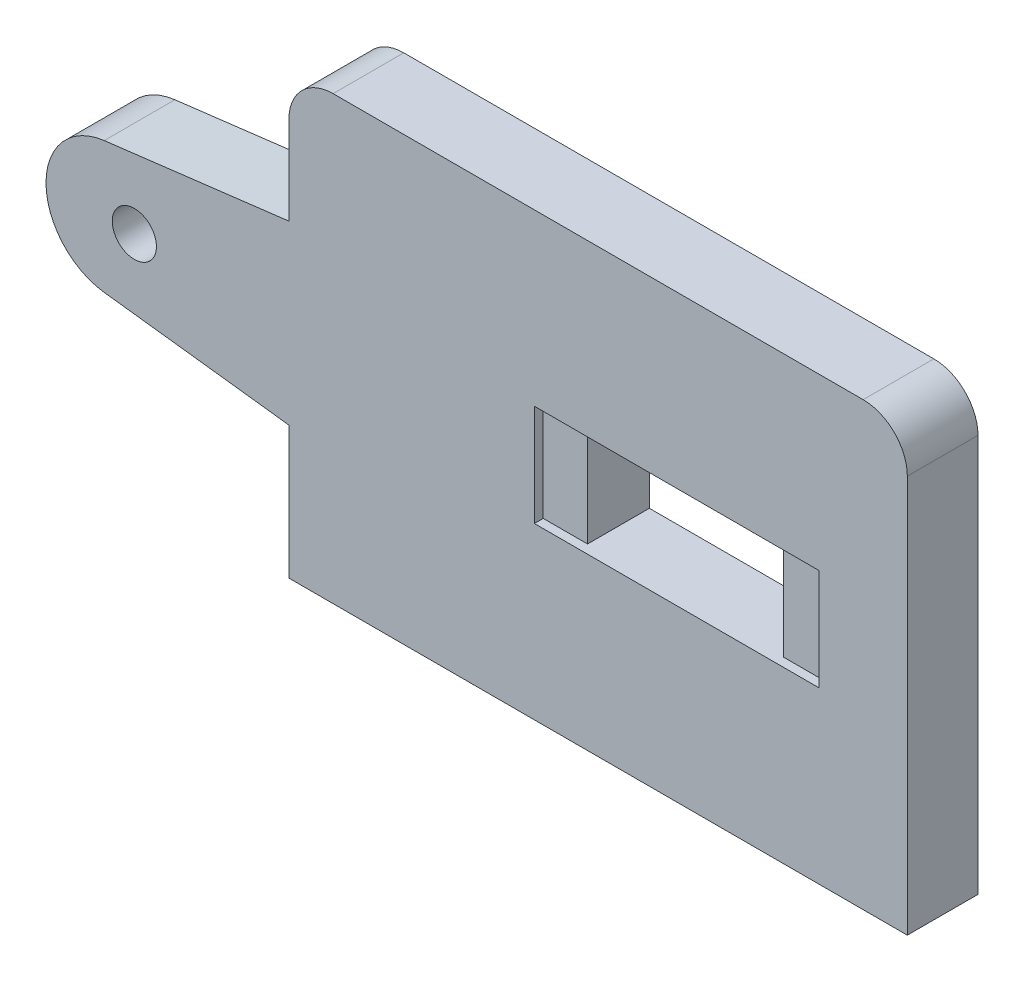
ISO-10303-21;
HEADER;
FILE_DESCRIPTION(('STEP AP214'),'2;1');
FILE_NAME('part.step','',(''),(''),'','','');
FILE_SCHEMA(('AUTOMOTIVE_DESIGN { 1 0 10303 214 1 1 1 1 }'));
ENDSEC;
DATA;
#1=APPLICATION_CONTEXT('core data for automotive mechanical design processes');
#2=APPLICATION_PROTOCOL_DEFINITION('international standard','automotive_design',2000,#1);
#3=PRODUCT_CONTEXT('',#1,'mechanical');
#4=PRODUCT('Part','Part','',(#3));
#5=PRODUCT_RELATED_PRODUCT_CATEGORY('part','',(#4));
#6=PRODUCT_DEFINITION_FORMATION('','',#4);
#7=PRODUCT_DEFINITION_CONTEXT('part definition',#1,'design');
#8=PRODUCT_DEFINITION('design','',#6,#7);
#9=PRODUCT_DEFINITION_SHAPE('','',#8);
#10=(LENGTH_UNIT() NAMED_UNIT(*) SI_UNIT(.MILLI.,.METRE.));
#11=(NAMED_UNIT(*) PLANE_ANGLE_UNIT() SI_UNIT($,.RADIAN.));
#12=(NAMED_UNIT(*) SI_UNIT($,.STERADIAN.) SOLID_ANGLE_UNIT());
#13=UNCERTAINTY_MEASURE_WITH_UNIT(LENGTH_MEASURE(1.E-05),#10,'distance_accuracy_value','');
#14=(GEOMETRIC_REPRESENTATION_CONTEXT(3) GLOBAL_UNCERTAINTY_ASSIGNED_CONTEXT((#13)) GLOBAL_UNIT_ASSIGNED_CONTEXT((#10,
#11,#12)) REPRESENTATION_CONTEXT('',''));
#15=CARTESIAN_POINT('',(0.,0.,0.));
#16=DIRECTION('',(0.,0.,1.));
#17=DIRECTION('',(1.,0.,0.));
#18=AXIS2_PLACEMENT_3D('',#15,#16,#17);
#19=CARTESIAN_POINT('',(0.,0.,8.));
#20=DIRECTION('',(0.,0.,1.));
#21=DIRECTION('',(1.,0.,0.));
#22=AXIS2_PLACEMENT_3D('',#19,#20,#21);
#23=PLANE('',#22);
#24=DIRECTION('',(1.,0.,0.));
#25=VECTOR('',#24,1.);
#26=CARTESIAN_POINT('',(-2.2,-5.75,8.));
#27=LINE('',#26,#25);
#28=CARTESIAN_POINT('',(-7.21473826229797,-5.75,8.));
#29=VERTEX_POINT('',#28);
#30=CARTESIAN_POINT('',(25.014738262298,-5.75,8.));
#31=VERTEX_POINT('',#30);
#32=EDGE_CURVE('E234',#29,#31,#27,.T.);
#33=ORIENTED_EDGE('',*,*,#32,.F.);
#34=DIRECTION('',(0.,-1.,0.));
#35=VECTOR('',#34,1.);
#36=CARTESIAN_POINT('',(-7.21473826229797,0.,8.));
#37=LINE('',#36,#35);
#38=CARTESIAN_POINT('',(-7.21473826229797,5.74999999999999,8.));
#39=VERTEX_POINT('',#38);
#40=EDGE_CURVE('E192',#39,#29,#37,.T.);
#41=ORIENTED_EDGE('',*,*,#40,.F.);
#42=DIRECTION('',(-1.,0.,0.));
#43=VECTOR('',#42,1.);
#44=CARTESIAN_POINT('',(-2.2,5.75,8.));
#45=LINE('',#44,#43);
#46=CARTESIAN_POINT('',(25.014738262298,5.75,8.));
#47=VERTEX_POINT('',#46);
#48=EDGE_CURVE('E173',#47,#39,#45,.T.);
#49=ORIENTED_EDGE('',*,*,#48,.F.);
#50=DIRECTION('',(0.,-1.,0.));
#51=VECTOR('',#50,1.);
#52=CARTESIAN_POINT('',(25.014738262298,0.,8.));
#53=LINE('',#52,#51);
#54=EDGE_CURVE('E207',#47,#31,#53,.T.);
#55=ORIENTED_EDGE('',*,*,#54,.T.);
#56=EDGE_LOOP('',(#33,#41,#49,#55));
#57=FACE_BOUND('',#56,.T.);
#58=CARTESIAN_POINT('',(-52.5,0.,8.));
#59=DIRECTION('',(0.,0.,1.));
#60=DIRECTION('',(1.,0.,0.));
#61=AXIS2_PLACEMENT_3D('',#58,#59,#60);
#62=CIRCLE('',#61,2.5);
#63=CARTESIAN_POINT('',(-50.,0.,8.));
#64=VERTEX_POINT('',#63);
#65=EDGE_CURVE('E201',#64,#64,#62,.T.);
#66=ORIENTED_EDGE('',*,*,#65,.F.);
#67=EDGE_LOOP('',(#66));
#68=FACE_BOUND('',#67,.T.);
#69=DIRECTION('',(-0.992614977317636,-0.121307488658818,0.));
#70=VECTOR('',#69,1.);
#71=CARTESIAN_POINT('',(-1.71915903920014,14.0672519855765,8.));
#72=LINE('',#71,#70);
#73=CARTESIAN_POINT('',(-35.,10.,8.));
#74=VERTEX_POINT('',#73);
#75=CARTESIAN_POINT('',(-55.9098061649411,7.44461232988227,8.));
#76=VERTEX_POINT('',#75);
#77=EDGE_CURVE('E264',#74,#76,#72,.T.);
#78=ORIENTED_EDGE('',*,*,#77,.T.);
#79=CARTESIAN_POINT('',(-55.,0.,8.));
#80=DIRECTION('',(0.,0.,1.));
#81=DIRECTION('',(1.,0.,0.));
#82=AXIS2_PLACEMENT_3D('',#79,#80,#81);
#83=CIRCLE('',#82,7.5);
#84=CARTESIAN_POINT('',(-55.9098061649411,-7.44461232988227,8.));
#85=VERTEX_POINT('',#84);
#86=EDGE_CURVE('E268',#76,#85,#83,.T.);
#87=ORIENTED_EDGE('',*,*,#86,.T.);
#88=DIRECTION('',(-0.992614977317636,0.121307488658818,0.));
#89=VECTOR('',#88,1.);
#90=CARTESIAN_POINT('',(-1.71915903920014,-14.0672519855765,8.));
#91=LINE('',#90,#89);
#92=CARTESIAN_POINT('',(-35.,-10.,8.));
#93=VERTEX_POINT('',#92);
#94=EDGE_CURVE('E272',#93,#85,#91,.T.);
#95=ORIENTED_EDGE('',*,*,#94,.F.);
#96=DIRECTION('',(0.,-1.,0.));
#97=VECTOR('',#96,1.);
#98=CARTESIAN_POINT('',(-35.,0.,8.));
#99=LINE('',#98,#97);
#100=CARTESIAN_POINT('',(-35.,-25.,8.));
#101=VERTEX_POINT('',#100);
#102=EDGE_CURVE('E276',#93,#101,#99,.T.);
#103=ORIENTED_EDGE('',*,*,#102,.T.);
#104=DIRECTION('',(1.,0.,0.));
#105=VECTOR('',#104,1.);
#106=CARTESIAN_POINT('',(0.,-25.,8.));
#107=LINE('',#106,#105);
#108=CARTESIAN_POINT('',(35.,-25.,8.));
#109=VERTEX_POINT('',#108);
#110=EDGE_CURVE('E279',#101,#109,#107,.T.);
#111=ORIENTED_EDGE('',*,*,#110,.T.);
#112=DIRECTION('',(0.,-1.,0.));
#113=VECTOR('',#112,1.);
#114=CARTESIAN_POINT('',(35.,0.,8.));
#115=LINE('',#114,#113);
#116=CARTESIAN_POINT('',(35.,20.,8.));
#117=VERTEX_POINT('',#116);
#118=EDGE_CURVE('E282',#117,#109,#115,.T.);
#119=ORIENTED_EDGE('',*,*,#118,.F.);
#120=CARTESIAN_POINT('',(30.,20.,8.));
#121=DIRECTION('',(0.,0.,1.));
#122=DIRECTION('',(1.,0.,0.));
#123=AXIS2_PLACEMENT_3D('',#120,#121,#122);
#124=CIRCLE('',#123,5.);
#125=CARTESIAN_POINT('',(30.,25.,8.));
#126=VERTEX_POINT('',#125);
#127=EDGE_CURVE('E286',#126,#117,#124,.F.);
#128=ORIENTED_EDGE('',*,*,#127,.F.);
#129=DIRECTION('',(1.,0.,0.));
#130=VECTOR('',#129,1.);
#131=CARTESIAN_POINT('',(0.,25.,8.));
#132=LINE('',#131,#130);
#133=CARTESIAN_POINT('',(-30.,25.,8.));
#134=VERTEX_POINT('',#133);
#135=EDGE_CURVE('E290',#134,#126,#132,.T.);
#136=ORIENTED_EDGE('',*,*,#135,.F.);
#137=CARTESIAN_POINT('',(-30.,20.,8.));
#138=DIRECTION('',(0.,0.,1.));
#139=DIRECTION('',(1.,0.,0.));
#140=AXIS2_PLACEMENT_3D('',#137,#138,#139);
#141=CIRCLE('',#140,5.);
#142=CARTESIAN_POINT('',(-35.,20.,8.));
#143=VERTEX_POINT('',#142);
#144=EDGE_CURVE('E294',#134,#143,#141,.T.);
#145=ORIENTED_EDGE('',*,*,#144,.T.);
#146=DIRECTION('',(0.,-1.,0.));
#147=VECTOR('',#146,1.);
#148=CARTESIAN_POINT('',(-35.,0.,8.));
#149=LINE('',#148,#147);
#150=EDGE_CURVE('E297',#143,#74,#149,.T.);
#151=ORIENTED_EDGE('',*,*,#150,.T.);
#152=EDGE_LOOP('',(#78,#87,#95,#103,#111,#119,#128,#136,#145,#151));
#153=FACE_BOUND('',#152,.T.);
#154=ADVANCED_FACE('F40',(#57,#68,#153),#23,.T.);
#155=CARTESIAN_POINT('',(20.,5.75,0.));
#156=DIRECTION('',(1.,0.,0.));
#157=DIRECTION('',(0.,0.,-1.));
#158=AXIS2_PLACEMENT_3D('',#155,#156,#157);
#159=PLANE('',#158);
#160=DIRECTION('',(0.,-1.,0.));
#161=VECTOR('',#160,1.);
#162=CARTESIAN_POINT('',(20.,0.,7.));
#163=LINE('',#162,#161);
#164=CARTESIAN_POINT('',(20.,5.75,7.));
#165=VERTEX_POINT('',#164);
#166=CARTESIAN_POINT('',(20.,-5.75,7.));
#167=VERTEX_POINT('',#166);
#168=EDGE_CURVE('E213',#165,#167,#163,.T.);
#169=ORIENTED_EDGE('',*,*,#168,.F.);
#170=DIRECTION('',(0.,0.,1.));
#171=VECTOR('',#170,1.);
#172=CARTESIAN_POINT('',(20.,5.75,0.));
#173=LINE('',#172,#171);
#174=CARTESIAN_POINT('',(20.,5.75,0.));
#175=VERTEX_POINT('',#174);
#176=EDGE_CURVE('E244',#175,#165,#173,.T.);
#177=ORIENTED_EDGE('',*,*,#176,.F.);
#178=DIRECTION('',(0.,1.,0.));
#179=VECTOR('',#178,1.);
#180=CARTESIAN_POINT('',(20.,5.75,0.));
#181=LINE('',#180,#179);
#182=CARTESIAN_POINT('',(20.,-5.75,0.));
#183=VERTEX_POINT('',#182);
#184=EDGE_CURVE('E229',#183,#175,#181,.T.);
#185=ORIENTED_EDGE('',*,*,#184,.F.);
#186=DIRECTION('',(0.,0.,1.));
#187=VECTOR('',#186,1.);
#188=CARTESIAN_POINT('',(20.,-5.75,0.));
#189=LINE('',#188,#187);
#190=EDGE_CURVE('E249',#183,#167,#189,.T.);
#191=ORIENTED_EDGE('',*,*,#190,.T.);
#192=EDGE_LOOP('',(#169,#177,#185,#191));
#193=FACE_BOUND('',#192,.T.);
#194=ADVANCED_FACE('F418',(#193),#159,.F.);
#195=CARTESIAN_POINT('',(-2.2,5.75,0.));
#196=DIRECTION('',(-1.,0.,0.));
#197=DIRECTION('',(0.,-1.,0.));
#198=AXIS2_PLACEMENT_3D('',#195,#196,#197);
#199=PLANE('',#198);
#200=DIRECTION('',(0.,1.,0.));
#201=VECTOR('',#200,1.);
#202=CARTESIAN_POINT('',(-2.2,0.,7.));
#203=LINE('',#202,#201);
#204=CARTESIAN_POINT('',(-2.2,-5.75,7.));
#205=VERTEX_POINT('',#204);
#206=CARTESIAN_POINT('',(-2.2,5.75,7.));
#207=VERTEX_POINT('',#206);
#208=EDGE_CURVE('E57',#205,#207,#203,.T.);
#209=ORIENTED_EDGE('',*,*,#208,.F.);
#210=DIRECTION('',(0.,0.,1.));
#211=VECTOR('',#210,1.);
#212=CARTESIAN_POINT('',(-2.2,-5.75,0.));
#213=LINE('',#212,#211);
#214=CARTESIAN_POINT('',(-2.2,-5.75,0.));
#215=VERTEX_POINT('',#214);
#216=EDGE_CURVE('E254',#215,#205,#213,.T.);
#217=ORIENTED_EDGE('',*,*,#216,.F.);
#218=DIRECTION('',(0.,-1.,0.));
#219=VECTOR('',#218,1.);
#220=CARTESIAN_POINT('',(-2.2,5.75,0.));
#221=LINE('',#220,#219);
#222=CARTESIAN_POINT('',(-2.2,5.75,0.));
#223=VERTEX_POINT('',#222);
#224=EDGE_CURVE('E65',#223,#215,#221,.T.);
#225=ORIENTED_EDGE('',*,*,#224,.F.);
#226=DIRECTION('',(0.,0.,1.));
#227=VECTOR('',#226,1.);
#228=CARTESIAN_POINT('',(-2.2,5.75,0.));
#229=LINE('',#228,#227);
#230=EDGE_CURVE('E258',#223,#207,#229,.T.);
#231=ORIENTED_EDGE('',*,*,#230,.T.);
#232=EDGE_LOOP('',(#209,#217,#225,#231));
#233=FACE_BOUND('',#232,.T.);
#234=ADVANCED_FACE('F425',(#233),#199,.F.);
#235=CARTESIAN_POINT('',(-1.71915903920014,14.0672519855765,8.));
#236=DIRECTION('',(0.121307488658818,-0.992614977317636,0.));
#237=DIRECTION('',(0.992614977317636,0.121307488658818,0.));
#238=AXIS2_PLACEMENT_3D('',#235,#236,#237);
#239=PLANE('',#238);
#240=DIRECTION('',(-0.992614977317636,-0.121307488658818,0.));
#241=VECTOR('',#240,1.);
#242=CARTESIAN_POINT('',(-1.71915903920014,14.0672519855765,0.));
#243=LINE('',#242,#241);
#244=CARTESIAN_POINT('',(-35.,10.,0.));
#245=VERTEX_POINT('',#244);
#246=CARTESIAN_POINT('',(-55.9098061649411,7.44461232988227,0.));
#247=VERTEX_POINT('',#246);
#248=EDGE_CURVE('E253',#245,#247,#243,.T.);
#249=ORIENTED_EDGE('',*,*,#248,.T.);
#250=DIRECTION('',(0.,0.,-1.));
#251=VECTOR('',#250,1.);
#252=CARTESIAN_POINT('',(-55.9098061649411,7.44461232988227,8.));
#253=LINE('',#252,#251);
#254=EDGE_CURVE('E11',#76,#247,#253,.T.);
#255=ORIENTED_EDGE('',*,*,#254,.F.);
#256=ORIENTED_EDGE('',*,*,#77,.F.);
#257=DIRECTION('',(0.,0.,-1.));
#258=VECTOR('',#257,1.);
#259=CARTESIAN_POINT('',(-35.,10.,8.));
#260=LINE('',#259,#258);
#261=EDGE_CURVE('E300',#74,#245,#260,.T.);
#262=ORIENTED_EDGE('',*,*,#261,.T.);
#263=EDGE_LOOP('',(#249,#255,#256,#262));
#264=FACE_BOUND('',#263,.T.);
#265=ADVANCED_FACE('F42',(#264),#239,.F.);
#266=CARTESIAN_POINT('',(-55.,0.,8.));
#267=DIRECTION('',(0.,0.,-1.));
#268=DIRECTION('',(-1.,0.,0.));
#269=AXIS2_PLACEMENT_3D('',#266,#267,#268);
#270=CYLINDRICAL_SURFACE('',#269,7.5);
#271=CARTESIAN_POINT('',(-55.,0.,0.));
#272=DIRECTION('',(0.,0.,1.));
#273=DIRECTION('',(1.,0.,0.));
#274=AXIS2_PLACEMENT_3D('',#271,#272,#273);
#275=CIRCLE('',#274,7.5);
#276=CARTESIAN_POINT('',(-55.9098061649411,-7.44461232988227,0.));
#277=VERTEX_POINT('',#276);
#278=EDGE_CURVE('E304',#247,#277,#275,.T.);
#279=ORIENTED_EDGE('',*,*,#278,.T.);
#280=DIRECTION('',(0.,0.,-1.));
#281=VECTOR('',#280,1.);
#282=CARTESIAN_POINT('',(-55.9098061649411,-7.44461232988227,8.));
#283=LINE('',#282,#281);
#284=EDGE_CURVE('E50',#85,#277,#283,.T.);
#285=ORIENTED_EDGE('',*,*,#284,.F.);
#286=ORIENTED_EDGE('',*,*,#86,.F.);
#287=ORIENTED_EDGE('',*,*,#254,.T.);
#288=EDGE_LOOP('',(#279,#285,#286,#287));
#289=FACE_BOUND('',#288,.T.);
#290=ADVANCED_FACE('F369',(#289),#270,.T.);
#291=CARTESIAN_POINT('',(-1.71915903920014,-14.0672519855765,8.));
#292=DIRECTION('',(-0.121307488658818,-0.992614977317636,0.));
#293=DIRECTION('',(0.992614977317636,-0.121307488658818,0.));
#294=AXIS2_PLACEMENT_3D('',#291,#292,#293);
#295=PLANE('',#294);
#296=DIRECTION('',(-0.992614977317636,0.121307488658818,0.));
#297=VECTOR('',#296,1.);
#298=CARTESIAN_POINT('',(-1.71915903920014,-14.0672519855765,0.));
#299=LINE('',#298,#297);
#300=CARTESIAN_POINT('',(-35.,-10.,0.));
#301=VERTEX_POINT('',#300);
#302=EDGE_CURVE('E308',#301,#277,#299,.T.);
#303=ORIENTED_EDGE('',*,*,#302,.F.);
#304=DIRECTION('',(0.,0.,-1.));
#305=VECTOR('',#304,1.);
#306=CARTESIAN_POINT('',(-35.,-10.,8.));
#307=LINE('',#306,#305);
#308=EDGE_CURVE('E359',#93,#301,#307,.T.);
#309=ORIENTED_EDGE('',*,*,#308,.F.);
#310=ORIENTED_EDGE('',*,*,#94,.T.);
#311=ORIENTED_EDGE('',*,*,#284,.T.);
#312=EDGE_LOOP('',(#303,#309,#310,#311));
#313=FACE_BOUND('',#312,.T.);
#314=ADVANCED_FACE('F366',(#313),#295,.T.);
#315=CARTESIAN_POINT('',(-35.,0.,8.));
#316=DIRECTION('',(1.,0.,0.));
#317=DIRECTION('',(0.,1.,0.));
#318=AXIS2_PLACEMENT_3D('',#315,#316,#317);
#319=PLANE('',#318);
#320=DIRECTION('',(0.,-1.,0.));
#321=VECTOR('',#320,1.);
#322=CARTESIAN_POINT('',(-35.,0.,0.));
#323=LINE('',#322,#321);
#324=CARTESIAN_POINT('',(-35.,-25.,0.));
#325=VERTEX_POINT('',#324);
#326=EDGE_CURVE('E312',#301,#325,#323,.T.);
#327=ORIENTED_EDGE('',*,*,#326,.T.);
#328=DIRECTION('',(0.,0.,-1.));
#329=VECTOR('',#328,1.);
#330=CARTESIAN_POINT('',(-35.,-25.,8.));
#331=LINE('',#330,#329);
#332=EDGE_CURVE('E355',#101,#325,#331,.T.);
#333=ORIENTED_EDGE('',*,*,#332,.F.);
#334=ORIENTED_EDGE('',*,*,#102,.F.);
#335=ORIENTED_EDGE('',*,*,#308,.T.);
#336=EDGE_LOOP('',(#327,#333,#334,#335));
#337=FACE_BOUND('',#336,.T.);
#338=ADVANCED_FACE('F378',(#337),#319,.F.);
#339=CARTESIAN_POINT('',(0.,-25.,8.));
#340=DIRECTION('',(0.,1.,0.));
#341=DIRECTION('',(0.,0.,1.));
#342=AXIS2_PLACEMENT_3D('',#339,#340,#341);
#343=PLANE('',#342);
#344=DIRECTION('',(1.,0.,0.));
#345=VECTOR('',#344,1.);
#346=CARTESIAN_POINT('',(0.,-25.,0.));
#347=LINE('',#346,#345);
#348=CARTESIAN_POINT('',(35.,-25.,0.));
#349=VERTEX_POINT('',#348);
#350=EDGE_CURVE('E315',#325,#349,#347,.T.);
#351=ORIENTED_EDGE('',*,*,#350,.T.);
#352=DIRECTION('',(0.,0.,-1.));
#353=VECTOR('',#352,1.);
#354=CARTESIAN_POINT('',(35.,-25.,8.));
#355=LINE('',#354,#353);
#356=EDGE_CURVE('E352',#109,#349,#355,.T.);
#357=ORIENTED_EDGE('',*,*,#356,.F.);
#358=ORIENTED_EDGE('',*,*,#110,.F.);
#359=ORIENTED_EDGE('',*,*,#332,.T.);
#360=EDGE_LOOP('',(#351,#357,#358,#359));
#361=FACE_BOUND('',#360,.T.);
#362=ADVANCED_FACE('F382',(#361),#343,.F.);
#363=CARTESIAN_POINT('',(35.,0.,8.));
#364=DIRECTION('',(1.,0.,0.));
#365=DIRECTION('',(0.,1.,0.));
#366=AXIS2_PLACEMENT_3D('',#363,#364,#365);
#367=PLANE('',#366);
#368=DIRECTION('',(0.,-1.,0.));
#369=VECTOR('',#368,1.);
#370=CARTESIAN_POINT('',(35.,0.,0.));
#371=LINE('',#370,#369);
#372=CARTESIAN_POINT('',(35.,20.,0.));
#373=VERTEX_POINT('',#372);
#374=EDGE_CURVE('E319',#373,#349,#371,.T.);
#375=ORIENTED_EDGE('',*,*,#374,.F.);
#376=DIRECTION('',(0.,0.,-1.));
#377=VECTOR('',#376,1.);
#378=CARTESIAN_POINT('',(35.,20.,8.));
#379=LINE('',#378,#377);
#380=EDGE_CURVE('E349',#117,#373,#379,.T.);
#381=ORIENTED_EDGE('',*,*,#380,.F.);
#382=ORIENTED_EDGE('',*,*,#118,.T.);
#383=ORIENTED_EDGE('',*,*,#356,.T.);
#384=EDGE_LOOP('',(#375,#381,#382,#383));
#385=FACE_BOUND('',#384,.T.);
#386=ADVANCED_FACE('F408',(#385),#367,.T.);
#387=CARTESIAN_POINT('',(30.,20.,8.));
#388=DIRECTION('',(0.,0.,-1.));
#389=DIRECTION('',(-1.,0.,0.));
#390=AXIS2_PLACEMENT_3D('',#387,#388,#389);
#391=CYLINDRICAL_SURFACE('',#390,5.);
#392=CARTESIAN_POINT('',(30.,20.,0.));
#393=DIRECTION('',(0.,0.,1.));
#394=DIRECTION('',(1.,0.,0.));
#395=AXIS2_PLACEMENT_3D('',#392,#393,#394);
#396=CIRCLE('',#395,5.);
#397=CARTESIAN_POINT('',(30.,25.,0.));
#398=VERTEX_POINT('',#397);
#399=EDGE_CURVE('E323',#398,#373,#396,.F.);
#400=ORIENTED_EDGE('',*,*,#399,.F.);
#401=DIRECTION('',(0.,0.,-1.));
#402=VECTOR('',#401,1.);
#403=CARTESIAN_POINT('',(30.,25.,8.));
#404=LINE('',#403,#402);
#405=EDGE_CURVE('E346',#126,#398,#404,.T.);
#406=ORIENTED_EDGE('',*,*,#405,.F.);
#407=ORIENTED_EDGE('',*,*,#127,.T.);
#408=ORIENTED_EDGE('',*,*,#380,.T.);
#409=EDGE_LOOP('',(#400,#406,#407,#408));
#410=FACE_BOUND('',#409,.T.);
#411=ADVANCED_FACE('F406',(#410),#391,.T.);
#412=CARTESIAN_POINT('',(0.,25.,8.));
#413=DIRECTION('',(0.,1.,0.));
#414=DIRECTION('',(0.,0.,1.));
#415=AXIS2_PLACEMENT_3D('',#412,#413,#414);
#416=PLANE('',#415);
#417=DIRECTION('',(1.,0.,0.));
#418=VECTOR('',#417,1.);
#419=CARTESIAN_POINT('',(0.,25.,0.));
#420=LINE('',#419,#418);
#421=CARTESIAN_POINT('',(-30.,25.,0.));
#422=VERTEX_POINT('',#421);
#423=EDGE_CURVE('E327',#422,#398,#420,.T.);
#424=ORIENTED_EDGE('',*,*,#423,.F.);
#425=DIRECTION('',(0.,0.,-1.));
#426=VECTOR('',#425,1.);
#427=CARTESIAN_POINT('',(-30.,25.,8.));
#428=LINE('',#427,#426);
#429=EDGE_CURVE('E343',#134,#422,#428,.T.);
#430=ORIENTED_EDGE('',*,*,#429,.F.);
#431=ORIENTED_EDGE('',*,*,#135,.T.);
#432=ORIENTED_EDGE('',*,*,#405,.T.);
#433=EDGE_LOOP('',(#424,#430,#431,#432));
#434=FACE_BOUND('',#433,.T.);
#435=ADVANCED_FACE('F402',(#434),#416,.T.);
#436=CARTESIAN_POINT('',(-30.,20.,8.));
#437=DIRECTION('',(0.,0.,-1.));
#438=DIRECTION('',(-1.,0.,0.));
#439=AXIS2_PLACEMENT_3D('',#436,#437,#438);
#440=CYLINDRICAL_SURFACE('',#439,5.);
#441=CARTESIAN_POINT('',(-30.,20.,0.));
#442=DIRECTION('',(0.,0.,1.));
#443=DIRECTION('',(1.,0.,0.));
#444=AXIS2_PLACEMENT_3D('',#441,#442,#443);
#445=CIRCLE('',#444,5.);
#446=CARTESIAN_POINT('',(-35.,20.,0.));
#447=VERTEX_POINT('',#446);
#448=EDGE_CURVE('E331',#422,#447,#445,.T.);
#449=ORIENTED_EDGE('',*,*,#448,.T.);
#450=DIRECTION('',(0.,0.,-1.));
#451=VECTOR('',#450,1.);
#452=CARTESIAN_POINT('',(-35.,20.,8.));
#453=LINE('',#452,#451);
#454=EDGE_CURVE('E339',#143,#447,#453,.T.);
#455=ORIENTED_EDGE('',*,*,#454,.F.);
#456=ORIENTED_EDGE('',*,*,#144,.F.);
#457=ORIENTED_EDGE('',*,*,#429,.T.);
#458=EDGE_LOOP('',(#449,#455,#456,#457));
#459=FACE_BOUND('',#458,.T.);
#460=ADVANCED_FACE('F399',(#459),#440,.T.);
#461=CARTESIAN_POINT('',(-35.,0.,8.));
#462=DIRECTION('',(1.,0.,0.));
#463=DIRECTION('',(0.,1.,0.));
#464=AXIS2_PLACEMENT_3D('',#461,#462,#463);
#465=PLANE('',#464);
#466=DIRECTION('',(0.,-1.,0.));
#467=VECTOR('',#466,1.);
#468=CARTESIAN_POINT('',(-35.,0.,0.));
#469=LINE('',#468,#467);
#470=EDGE_CURVE('E269',#447,#245,#469,.T.);
#471=ORIENTED_EDGE('',*,*,#470,.T.);
#472=ORIENTED_EDGE('',*,*,#261,.F.);
#473=ORIENTED_EDGE('',*,*,#150,.F.);
#474=ORIENTED_EDGE('',*,*,#454,.T.);
#475=EDGE_LOOP('',(#471,#472,#473,#474));
#476=FACE_BOUND('',#475,.T.);
#477=ADVANCED_FACE('F395',(#476),#465,.F.);
#478=CARTESIAN_POINT('',(0.,0.,0.));
#479=DIRECTION('',(0.,0.,1.));
#480=DIRECTION('',(1.,0.,0.));
#481=AXIS2_PLACEMENT_3D('',#478,#479,#480);
#482=PLANE('',#481);
#483=CARTESIAN_POINT('',(-52.5,0.,0.));
#484=DIRECTION('',(0.,0.,1.));
#485=DIRECTION('',(1.,0.,0.));
#486=AXIS2_PLACEMENT_3D('',#483,#484,#485);
#487=CIRCLE('',#486,2.5);
#488=CARTESIAN_POINT('',(-50.,0.,0.));
#489=VERTEX_POINT('',#488);
#490=EDGE_CURVE('E44',#489,#489,#487,.T.);
#491=ORIENTED_EDGE('',*,*,#490,.T.);
#492=EDGE_LOOP('',(#491));
#493=FACE_BOUND('',#492,.T.);
#494=DIRECTION('',(1.,0.,0.));
#495=VECTOR('',#494,1.);
#496=CARTESIAN_POINT('',(-2.2,-5.75,0.));
#497=LINE('',#496,#495);
#498=EDGE_CURVE('E240',#215,#183,#497,.T.);
#499=ORIENTED_EDGE('',*,*,#498,.T.);
#500=ORIENTED_EDGE('',*,*,#184,.T.);
#501=DIRECTION('',(-1.,0.,0.));
#502=VECTOR('',#501,1.);
#503=CARTESIAN_POINT('',(-2.2,5.75,0.));
#504=LINE('',#503,#502);
#505=EDGE_CURVE('E233',#175,#223,#504,.T.);
#506=ORIENTED_EDGE('',*,*,#505,.T.);
#507=ORIENTED_EDGE('',*,*,#224,.T.);
#508=EDGE_LOOP('',(#499,#500,#506,#507));
#509=FACE_BOUND('',#508,.T.);
#510=ORIENTED_EDGE('',*,*,#248,.F.);
#511=ORIENTED_EDGE('',*,*,#470,.F.);
#512=ORIENTED_EDGE('',*,*,#448,.F.);
#513=ORIENTED_EDGE('',*,*,#423,.T.);
#514=ORIENTED_EDGE('',*,*,#399,.T.);
#515=ORIENTED_EDGE('',*,*,#374,.T.);
#516=ORIENTED_EDGE('',*,*,#350,.F.);
#517=ORIENTED_EDGE('',*,*,#326,.F.);
#518=ORIENTED_EDGE('',*,*,#302,.T.);
#519=ORIENTED_EDGE('',*,*,#278,.F.);
#520=EDGE_LOOP('',(#510,#511,#512,#513,#514,#515,#516,#517,#518,#519));
#521=FACE_BOUND('',#520,.T.);
#522=ADVANCED_FACE('F374',(#493,#509,#521),#482,.F.);
#523=CARTESIAN_POINT('',(-2.2,-5.75,0.));
#524=DIRECTION('',(0.,-1.,0.));
#525=DIRECTION('',(0.,0.,-1.));
#526=AXIS2_PLACEMENT_3D('',#523,#524,#525);
#527=PLANE('',#526);
#528=ORIENTED_EDGE('',*,*,#32,.T.);
#529=DIRECTION('',(0.,0.,1.));
#530=VECTOR('',#529,1.);
#531=CARTESIAN_POINT('',(25.014738262298,-5.75,7.));
#532=LINE('',#531,#530);
#533=CARTESIAN_POINT('',(25.014738262298,-5.75,7.));
#534=VERTEX_POINT('',#533);
#535=EDGE_CURVE('E217',#534,#31,#532,.T.);
#536=ORIENTED_EDGE('',*,*,#535,.F.);
#537=DIRECTION('',(-1.,0.,0.));
#538=VECTOR('',#537,1.);
#539=CARTESIAN_POINT('',(0.,-5.75,7.));
#540=LINE('',#539,#538);
#541=EDGE_CURVE('E203',#534,#167,#540,.T.);
#542=ORIENTED_EDGE('',*,*,#541,.T.);
#543=ORIENTED_EDGE('',*,*,#190,.F.);
#544=ORIENTED_EDGE('',*,*,#498,.F.);
#545=ORIENTED_EDGE('',*,*,#216,.T.);
#546=DIRECTION('',(1.,0.,0.));
#547=VECTOR('',#546,1.);
#548=CARTESIAN_POINT('',(0.,-5.75,7.));
#549=LINE('',#548,#547);
#550=CARTESIAN_POINT('',(-7.21473826229797,-5.75,7.));
#551=VERTEX_POINT('',#550);
#552=EDGE_CURVE('E179',#551,#205,#549,.T.);
#553=ORIENTED_EDGE('',*,*,#552,.F.);
#554=DIRECTION('',(0.,0.,1.));
#555=VECTOR('',#554,1.);
#556=CARTESIAN_POINT('',(-7.21473826229797,-5.75,7.));
#557=LINE('',#556,#555);
#558=EDGE_CURVE('E178',#551,#29,#557,.T.);
#559=ORIENTED_EDGE('',*,*,#558,.T.);
#560=EDGE_LOOP('',(#528,#536,#542,#543,#544,#545,#553,#559));
#561=FACE_BOUND('',#560,.T.);
#562=ADVANCED_FACE('F433',(#561),#527,.F.);
#563=CARTESIAN_POINT('',(-2.2,5.75,0.));
#564=DIRECTION('',(0.,1.,0.));
#565=DIRECTION('',(0.,0.,1.));
#566=AXIS2_PLACEMENT_3D('',#563,#564,#565);
#567=PLANE('',#566);
#568=ORIENTED_EDGE('',*,*,#48,.T.);
#569=DIRECTION('',(0.,0.,1.));
#570=VECTOR('',#569,1.);
#571=CARTESIAN_POINT('',(-7.21473826229797,5.74999999999999,7.));
#572=LINE('',#571,#570);
#573=CARTESIAN_POINT('',(-7.21473826229797,5.74999999999999,7.));
#574=VERTEX_POINT('',#573);
#575=EDGE_CURVE('E168',#574,#39,#572,.T.);
#576=ORIENTED_EDGE('',*,*,#575,.F.);
#577=DIRECTION('',(-1.,0.,0.));
#578=VECTOR('',#577,1.);
#579=CARTESIAN_POINT('',(0.,5.75,7.));
#580=LINE('',#579,#578);
#581=EDGE_CURVE('E171',#207,#574,#580,.T.);
#582=ORIENTED_EDGE('',*,*,#581,.F.);
#583=ORIENTED_EDGE('',*,*,#230,.F.);
#584=ORIENTED_EDGE('',*,*,#505,.F.);
#585=ORIENTED_EDGE('',*,*,#176,.T.);
#586=DIRECTION('',(1.,0.,0.));
#587=VECTOR('',#586,1.);
#588=CARTESIAN_POINT('',(0.,5.75,7.));
#589=LINE('',#588,#587);
#590=CARTESIAN_POINT('',(25.014738262298,5.75,7.));
#591=VERTEX_POINT('',#590);
#592=EDGE_CURVE('E210',#165,#591,#589,.T.);
#593=ORIENTED_EDGE('',*,*,#592,.T.);
#594=DIRECTION('',(0.,0.,1.));
#595=VECTOR('',#594,1.);
#596=CARTESIAN_POINT('',(25.014738262298,5.75,7.));
#597=LINE('',#596,#595);
#598=EDGE_CURVE('E199',#591,#47,#597,.T.);
#599=ORIENTED_EDGE('',*,*,#598,.T.);
#600=EDGE_LOOP('',(#568,#576,#582,#583,#584,#585,#593,#599));
#601=FACE_BOUND('',#600,.T.);
#602=ADVANCED_FACE('F170',(#601),#567,.F.);
#603=CARTESIAN_POINT('',(-52.5,0.,-12.));
#604=DIRECTION('',(0.,0.,1.));
#605=DIRECTION('',(1.,0.,0.));
#606=AXIS2_PLACEMENT_3D('',#603,#604,#605);
#607=CYLINDRICAL_SURFACE('',#606,2.5);
#608=ORIENTED_EDGE('',*,*,#65,.T.);
#609=EDGE_LOOP('',(#608));
#610=FACE_BOUND('',#609,.T.);
#611=ORIENTED_EDGE('',*,*,#490,.F.);
#612=EDGE_LOOP('',(#611));
#613=FACE_BOUND('',#612,.T.);
#614=ADVANCED_FACE('F459',(#610,#613),#607,.F.);
#615=CARTESIAN_POINT('',(25.014738262298,0.,7.));
#616=DIRECTION('',(-1.,0.,0.));
#617=DIRECTION('',(0.,0.,1.));
#618=AXIS2_PLACEMENT_3D('',#615,#616,#617);
#619=PLANE('',#618);
#620=ORIENTED_EDGE('',*,*,#54,.F.);
#621=ORIENTED_EDGE('',*,*,#598,.F.);
#622=DIRECTION('',(0.,-1.,0.));
#623=VECTOR('',#622,1.);
#624=CARTESIAN_POINT('',(25.014738262298,0.,7.));
#625=LINE('',#624,#623);
#626=EDGE_CURVE('E206',#591,#534,#625,.T.);
#627=ORIENTED_EDGE('',*,*,#626,.T.);
#628=ORIENTED_EDGE('',*,*,#535,.T.);
#629=EDGE_LOOP('',(#620,#621,#627,#628));
#630=FACE_BOUND('',#629,.T.);
#631=ADVANCED_FACE('F462',(#630),#619,.T.);
#632=CARTESIAN_POINT('',(0.,0.,7.));
#633=DIRECTION('',(0.,0.,1.));
#634=DIRECTION('',(1.,0.,0.));
#635=AXIS2_PLACEMENT_3D('',#632,#633,#634);
#636=PLANE('',#635);
#637=ORIENTED_EDGE('',*,*,#541,.F.);
#638=ORIENTED_EDGE('',*,*,#626,.F.);
#639=ORIENTED_EDGE('',*,*,#592,.F.);
#640=ORIENTED_EDGE('',*,*,#168,.T.);
#641=EDGE_LOOP('',(#637,#638,#639,#640));
#642=FACE_BOUND('',#641,.T.);
#643=ADVANCED_FACE('F499',(#642),#636,.T.);
#644=CARTESIAN_POINT('',(-7.21473826229797,0.,7.));
#645=DIRECTION('',(-1.,0.,0.));
#646=DIRECTION('',(0.,-1.,0.));
#647=AXIS2_PLACEMENT_3D('',#644,#645,#646);
#648=PLANE('',#647);
#649=ORIENTED_EDGE('',*,*,#40,.T.);
#650=ORIENTED_EDGE('',*,*,#558,.F.);
#651=DIRECTION('',(0.,-1.,0.));
#652=VECTOR('',#651,1.);
#653=CARTESIAN_POINT('',(-7.21473826229797,0.,7.));
#654=LINE('',#653,#652);
#655=EDGE_CURVE('E182',#574,#551,#654,.T.);
#656=ORIENTED_EDGE('',*,*,#655,.F.);
#657=ORIENTED_EDGE('',*,*,#575,.T.);
#658=EDGE_LOOP('',(#649,#650,#656,#657));
#659=FACE_BOUND('',#658,.T.);
#660=ADVANCED_FACE('F183',(#659),#648,.F.);
#661=CARTESIAN_POINT('',(0.,0.,7.));
#662=DIRECTION('',(0.,0.,1.));
#663=DIRECTION('',(1.,0.,0.));
#664=AXIS2_PLACEMENT_3D('',#661,#662,#663);
#665=PLANE('',#664);
#666=ORIENTED_EDGE('',*,*,#208,.T.);
#667=ORIENTED_EDGE('',*,*,#581,.T.);
#668=ORIENTED_EDGE('',*,*,#655,.T.);
#669=ORIENTED_EDGE('',*,*,#552,.T.);
#670=EDGE_LOOP('',(#666,#667,#668,#669));
#671=FACE_BOUND('',#670,.T.);
#672=ADVANCED_FACE('F188',(#671),#665,.T.);
#673=CLOSED_SHELL('',(#154,#194,#234,#265,#290,#314,#338,#362,#386,#411,#435,#460,#477,#522,
#562,#602,#614,#631,#643,#660,#672));
#674=MANIFOLD_SOLID_BREP('B2',#673);
#675=ADVANCED_BREP_SHAPE_REPRESENTATION('',(#18,#674),#14);
#676=SHAPE_DEFINITION_REPRESENTATION(#9,#675);
ENDSEC;
END-ISO-10303-21;
